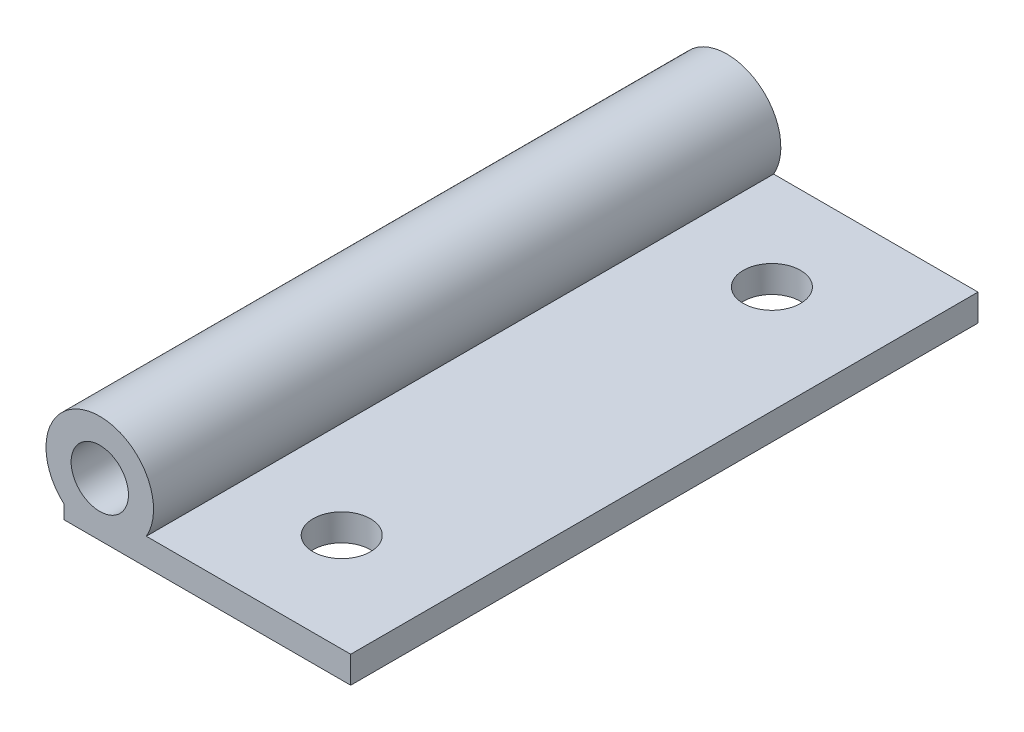
ISO-10303-21;
HEADER;
FILE_DESCRIPTION(('STEP AP214'),'2;1');
FILE_NAME('part.step','',(''),(''),'','','');
FILE_SCHEMA(('AUTOMOTIVE_DESIGN { 1 0 10303 214 1 1 1 1 }'));
ENDSEC;
DATA;
#1=APPLICATION_CONTEXT('core data for automotive mechanical design processes');
#2=APPLICATION_PROTOCOL_DEFINITION('international standard','automotive_design',2000,#1);
#3=PRODUCT_CONTEXT('',#1,'mechanical');
#4=PRODUCT('Part','Part','',(#3));
#5=PRODUCT_RELATED_PRODUCT_CATEGORY('part','',(#4));
#6=PRODUCT_DEFINITION_FORMATION('','',#4);
#7=PRODUCT_DEFINITION_CONTEXT('part definition',#1,'design');
#8=PRODUCT_DEFINITION('design','',#6,#7);
#9=PRODUCT_DEFINITION_SHAPE('','',#8);
#10=(LENGTH_UNIT() NAMED_UNIT(*) SI_UNIT(.MILLI.,.METRE.));
#11=(NAMED_UNIT(*) PLANE_ANGLE_UNIT() SI_UNIT($,.RADIAN.));
#12=(NAMED_UNIT(*) SI_UNIT($,.STERADIAN.) SOLID_ANGLE_UNIT());
#13=UNCERTAINTY_MEASURE_WITH_UNIT(LENGTH_MEASURE(1.E-05),#10,'distance_accuracy_value','');
#14=(GEOMETRIC_REPRESENTATION_CONTEXT(3) GLOBAL_UNCERTAINTY_ASSIGNED_CONTEXT((#13)) GLOBAL_UNIT_ASSIGNED_CONTEXT((#10,
#11,#12)) REPRESENTATION_CONTEXT('',''));
#15=CARTESIAN_POINT('',(0.,0.,0.));
#16=DIRECTION('',(0.,0.,1.));
#17=DIRECTION('',(1.,0.,0.));
#18=AXIS2_PLACEMENT_3D('',#15,#16,#17);
#19=CARTESIAN_POINT('',(0.,0.,17.5));
#20=DIRECTION('',(0.,0.,-1.));
#21=DIRECTION('',(-1.,0.,0.));
#22=AXIS2_PLACEMENT_3D('',#19,#20,#21);
#23=CYLINDRICAL_SURFACE('',#22,3.);
#24=DIRECTION('',(0.,0.,-1.));
#25=VECTOR('',#24,1.);
#26=CARTESIAN_POINT('',(-2.,-2.23606797749979,17.5));
#27=LINE('',#26,#25);
#28=CARTESIAN_POINT('',(-2.,-2.23606797749979,17.5));
#29=VERTEX_POINT('',#28);
#30=CARTESIAN_POINT('',(-2.,-2.23606797749979,-17.5));
#31=VERTEX_POINT('',#30);
#32=EDGE_CURVE('E58',#29,#31,#27,.T.);
#33=ORIENTED_EDGE('',*,*,#32,.F.);
#34=CARTESIAN_POINT('',(0.,0.,17.5));
#35=DIRECTION('',(0.,0.,1.));
#36=DIRECTION('',(1.,0.,0.));
#37=AXIS2_PLACEMENT_3D('',#34,#35,#36);
#38=CIRCLE('',#37,3.);
#39=CARTESIAN_POINT('',(2.59807621135332,-1.5,17.5));
#40=VERTEX_POINT('',#39);
#41=EDGE_CURVE('E11',#40,#29,#38,.T.);
#42=ORIENTED_EDGE('',*,*,#41,.F.);
#43=DIRECTION('',(0.,0.,-1.));
#44=VECTOR('',#43,1.);
#45=CARTESIAN_POINT('',(2.59807621135332,-1.5,17.5));
#46=LINE('',#45,#44);
#47=CARTESIAN_POINT('',(2.59807621135332,-1.5,-17.5));
#48=VERTEX_POINT('',#47);
#49=EDGE_CURVE('E106',#48,#40,#46,.F.);
#50=ORIENTED_EDGE('',*,*,#49,.F.);
#51=CARTESIAN_POINT('',(0.,0.,-17.5));
#52=DIRECTION('',(0.,0.,1.));
#53=DIRECTION('',(1.,0.,0.));
#54=AXIS2_PLACEMENT_3D('',#51,#52,#53);
#55=CIRCLE('',#54,3.);
#56=EDGE_CURVE('E47',#48,#31,#55,.T.);
#57=ORIENTED_EDGE('',*,*,#56,.T.);
#58=EDGE_LOOP('',(#33,#42,#50,#57));
#59=FACE_BOUND('',#58,.T.);
#60=ADVANCED_FACE('F39',(#59),#23,.T.);
#61=CARTESIAN_POINT('',(0.,0.,17.5));
#62=DIRECTION('',(0.,0.,1.));
#63=DIRECTION('',(1.,0.,0.));
#64=AXIS2_PLACEMENT_3D('',#61,#62,#63);
#65=PLANE('',#64);
#66=CARTESIAN_POINT('',(0.,0.,17.5));
#67=DIRECTION('',(0.,0.,1.));
#68=DIRECTION('',(1.,0.,0.));
#69=AXIS2_PLACEMENT_3D('',#66,#67,#68);
#70=CIRCLE('',#69,1.6);
#71=CARTESIAN_POINT('',(1.6,0.,17.5));
#72=VERTEX_POINT('',#71);
#73=EDGE_CURVE('E117',#72,#72,#70,.F.);
#74=ORIENTED_EDGE('',*,*,#73,.T.);
#75=EDGE_LOOP('',(#74));
#76=FACE_BOUND('',#75,.T.);
#77=ORIENTED_EDGE('',*,*,#41,.T.);
#78=DIRECTION('',(0.,-1.,0.));
#79=VECTOR('',#78,1.);
#80=CARTESIAN_POINT('',(-2.,-1.5,17.5));
#81=LINE('',#80,#79);
#82=CARTESIAN_POINT('',(-2.,-3.,17.5));
#83=VERTEX_POINT('',#82);
#84=EDGE_CURVE('E83',#29,#83,#81,.T.);
#85=ORIENTED_EDGE('',*,*,#84,.T.);
#86=DIRECTION('',(1.,0.,0.));
#87=VECTOR('',#86,1.);
#88=CARTESIAN_POINT('',(-2.,-3.,17.5));
#89=LINE('',#88,#87);
#90=CARTESIAN_POINT('',(14.,-3.,17.5));
#91=VERTEX_POINT('',#90);
#92=EDGE_CURVE('E86',#83,#91,#89,.T.);
#93=ORIENTED_EDGE('',*,*,#92,.T.);
#94=DIRECTION('',(0.,1.,0.));
#95=VECTOR('',#94,1.);
#96=CARTESIAN_POINT('',(14.,-3.,17.5));
#97=LINE('',#96,#95);
#98=CARTESIAN_POINT('',(14.,-1.5,17.5));
#99=VERTEX_POINT('',#98);
#100=EDGE_CURVE('E100',#91,#99,#97,.T.);
#101=ORIENTED_EDGE('',*,*,#100,.T.);
#102=DIRECTION('',(-1.,0.,0.));
#103=VECTOR('',#102,1.);
#104=CARTESIAN_POINT('',(14.,-1.5,17.5));
#105=LINE('',#104,#103);
#106=EDGE_CURVE('E135',#99,#40,#105,.T.);
#107=ORIENTED_EDGE('',*,*,#106,.T.);
#108=EDGE_LOOP('',(#77,#85,#93,#101,#107));
#109=FACE_BOUND('',#108,.T.);
#110=ADVANCED_FACE('F85',(#76,#109),#65,.T.);
#111=CARTESIAN_POINT('',(0.,0.,-17.5));
#112=DIRECTION('',(0.,0.,1.));
#113=DIRECTION('',(1.,0.,0.));
#114=AXIS2_PLACEMENT_3D('',#111,#112,#113);
#115=PLANE('',#114);
#116=CARTESIAN_POINT('',(0.,0.,-17.5));
#117=DIRECTION('',(0.,0.,1.));
#118=DIRECTION('',(1.,0.,0.));
#119=AXIS2_PLACEMENT_3D('',#116,#117,#118);
#120=CIRCLE('',#119,1.6);
#121=CARTESIAN_POINT('',(1.6,0.,-17.5));
#122=VERTEX_POINT('',#121);
#123=EDGE_CURVE('E115',#122,#122,#120,.F.);
#124=ORIENTED_EDGE('',*,*,#123,.F.);
#125=EDGE_LOOP('',(#124));
#126=FACE_BOUND('',#125,.T.);
#127=DIRECTION('',(1.,0.,0.));
#128=VECTOR('',#127,1.);
#129=CARTESIAN_POINT('',(-2.,-3.,-17.5));
#130=LINE('',#129,#128);
#131=CARTESIAN_POINT('',(-2.,-3.,-17.5));
#132=VERTEX_POINT('',#131);
#133=CARTESIAN_POINT('',(14.,-3.,-17.5));
#134=VERTEX_POINT('',#133);
#135=EDGE_CURVE('E138',#132,#134,#130,.T.);
#136=ORIENTED_EDGE('',*,*,#135,.F.);
#137=DIRECTION('',(0.,-1.,0.));
#138=VECTOR('',#137,1.);
#139=CARTESIAN_POINT('',(-2.,-1.5,-17.5));
#140=LINE('',#139,#138);
#141=EDGE_CURVE('E105',#31,#132,#140,.T.);
#142=ORIENTED_EDGE('',*,*,#141,.F.);
#143=ORIENTED_EDGE('',*,*,#56,.F.);
#144=DIRECTION('',(-1.,0.,0.));
#145=VECTOR('',#144,1.);
#146=CARTESIAN_POINT('',(14.,-1.5,-17.5));
#147=LINE('',#146,#145);
#148=CARTESIAN_POINT('',(14.,-1.5,-17.5));
#149=VERTEX_POINT('',#148);
#150=EDGE_CURVE('E91',#149,#48,#147,.T.);
#151=ORIENTED_EDGE('',*,*,#150,.F.);
#152=DIRECTION('',(0.,1.,0.));
#153=VECTOR('',#152,1.);
#154=CARTESIAN_POINT('',(14.,-3.,-17.5));
#155=LINE('',#154,#153);
#156=EDGE_CURVE('E140',#134,#149,#155,.T.);
#157=ORIENTED_EDGE('',*,*,#156,.F.);
#158=EDGE_LOOP('',(#136,#142,#143,#151,#157));
#159=FACE_BOUND('',#158,.T.);
#160=ADVANCED_FACE('F152',(#126,#159),#115,.F.);
#161=CARTESIAN_POINT('',(-2.,-1.5,17.5));
#162=DIRECTION('',(1.,0.,0.));
#163=DIRECTION('',(0.,0.,-1.));
#164=AXIS2_PLACEMENT_3D('',#161,#162,#163);
#165=PLANE('',#164);
#166=ORIENTED_EDGE('',*,*,#84,.F.);
#167=ORIENTED_EDGE('',*,*,#32,.T.);
#168=ORIENTED_EDGE('',*,*,#141,.T.);
#169=DIRECTION('',(0.,0.,-1.));
#170=VECTOR('',#169,1.);
#171=CARTESIAN_POINT('',(-2.,-3.,17.5));
#172=LINE('',#171,#170);
#173=EDGE_CURVE('E96',#83,#132,#172,.T.);
#174=ORIENTED_EDGE('',*,*,#173,.F.);
#175=EDGE_LOOP('',(#166,#167,#168,#174));
#176=FACE_BOUND('',#175,.T.);
#177=ADVANCED_FACE('F103',(#176),#165,.F.);
#178=CARTESIAN_POINT('',(-2.,-3.,17.5));
#179=DIRECTION('',(0.,1.,0.));
#180=DIRECTION('',(0.,0.,1.));
#181=AXIS2_PLACEMENT_3D('',#178,#179,#180);
#182=PLANE('',#181);
#183=CARTESIAN_POINT('',(8.,-3.,12.));
#184=DIRECTION('',(0.,1.,0.));
#185=DIRECTION('',(0.,0.,1.));
#186=AXIS2_PLACEMENT_3D('',#183,#184,#185);
#187=CIRCLE('',#186,1.6);
#188=CARTESIAN_POINT('',(8.,-3.,13.6));
#189=VERTEX_POINT('',#188);
#190=EDGE_CURVE('E121',#189,#189,#187,.T.);
#191=ORIENTED_EDGE('',*,*,#190,.T.);
#192=EDGE_LOOP('',(#191));
#193=FACE_BOUND('',#192,.T.);
#194=CARTESIAN_POINT('',(8.,-3.,-12.));
#195=DIRECTION('',(0.,1.,0.));
#196=DIRECTION('',(0.,0.,1.));
#197=AXIS2_PLACEMENT_3D('',#194,#195,#196);
#198=CIRCLE('',#197,1.6);
#199=CARTESIAN_POINT('',(8.,-3.,-10.4));
#200=VERTEX_POINT('',#199);
#201=EDGE_CURVE('E118',#200,#200,#198,.T.);
#202=ORIENTED_EDGE('',*,*,#201,.T.);
#203=EDGE_LOOP('',(#202));
#204=FACE_BOUND('',#203,.T.);
#205=DIRECTION('',(0.,0.,-1.));
#206=VECTOR('',#205,1.);
#207=CARTESIAN_POINT('',(14.,-3.,17.5));
#208=LINE('',#207,#206);
#209=EDGE_CURVE('E98',#91,#134,#208,.T.);
#210=ORIENTED_EDGE('',*,*,#209,.F.);
#211=ORIENTED_EDGE('',*,*,#92,.F.);
#212=ORIENTED_EDGE('',*,*,#173,.T.);
#213=ORIENTED_EDGE('',*,*,#135,.T.);
#214=EDGE_LOOP('',(#210,#211,#212,#213));
#215=FACE_BOUND('',#214,.T.);
#216=ADVANCED_FACE('F95',(#193,#204,#215),#182,.F.);
#217=CARTESIAN_POINT('',(14.,-1.5,17.5));
#218=DIRECTION('',(0.,-1.,0.));
#219=DIRECTION('',(0.,0.,-1.));
#220=AXIS2_PLACEMENT_3D('',#217,#218,#219);
#221=PLANE('',#220);
#222=CARTESIAN_POINT('',(8.,-1.5,12.));
#223=DIRECTION('',(0.,-1.,0.));
#224=DIRECTION('',(0.,0.,-1.));
#225=AXIS2_PLACEMENT_3D('',#222,#223,#224);
#226=CIRCLE('',#225,1.6);
#227=CARTESIAN_POINT('',(8.,-1.5,10.4));
#228=VERTEX_POINT('',#227);
#229=EDGE_CURVE('E42',#228,#228,#226,.T.);
#230=ORIENTED_EDGE('',*,*,#229,.T.);
#231=EDGE_LOOP('',(#230));
#232=FACE_BOUND('',#231,.T.);
#233=CARTESIAN_POINT('',(8.,-1.5,-12.));
#234=DIRECTION('',(0.,-1.,0.));
#235=DIRECTION('',(0.,0.,-1.));
#236=AXIS2_PLACEMENT_3D('',#233,#234,#235);
#237=CIRCLE('',#236,1.6);
#238=CARTESIAN_POINT('',(8.,-1.5,-13.6));
#239=VERTEX_POINT('',#238);
#240=EDGE_CURVE('E119',#239,#239,#237,.T.);
#241=ORIENTED_EDGE('',*,*,#240,.T.);
#242=EDGE_LOOP('',(#241));
#243=FACE_BOUND('',#242,.T.);
#244=ORIENTED_EDGE('',*,*,#150,.T.);
#245=ORIENTED_EDGE('',*,*,#49,.T.);
#246=ORIENTED_EDGE('',*,*,#106,.F.);
#247=DIRECTION('',(0.,0.,-1.));
#248=VECTOR('',#247,1.);
#249=CARTESIAN_POINT('',(14.,-1.5,17.5));
#250=LINE('',#249,#248);
#251=EDGE_CURVE('E109',#99,#149,#250,.T.);
#252=ORIENTED_EDGE('',*,*,#251,.T.);
#253=EDGE_LOOP('',(#244,#245,#246,#252));
#254=FACE_BOUND('',#253,.T.);
#255=ADVANCED_FACE('F148',(#232,#243,#254),#221,.F.);
#256=CARTESIAN_POINT('',(14.,-3.,17.5));
#257=DIRECTION('',(-1.,0.,0.));
#258=DIRECTION('',(0.,0.,1.));
#259=AXIS2_PLACEMENT_3D('',#256,#257,#258);
#260=PLANE('',#259);
#261=ORIENTED_EDGE('',*,*,#156,.T.);
#262=ORIENTED_EDGE('',*,*,#251,.F.);
#263=ORIENTED_EDGE('',*,*,#100,.F.);
#264=ORIENTED_EDGE('',*,*,#209,.T.);
#265=EDGE_LOOP('',(#261,#262,#263,#264));
#266=FACE_BOUND('',#265,.T.);
#267=ADVANCED_FACE('F153',(#266),#260,.F.);
#268=CARTESIAN_POINT('',(0.,0.,20.));
#269=DIRECTION('',(0.,0.,-1.));
#270=DIRECTION('',(-1.,0.,0.));
#271=AXIS2_PLACEMENT_3D('',#268,#269,#270);
#272=CYLINDRICAL_SURFACE('',#271,1.6);
#273=ORIENTED_EDGE('',*,*,#73,.F.);
#274=EDGE_LOOP('',(#273));
#275=FACE_BOUND('',#274,.T.);
#276=ORIENTED_EDGE('',*,*,#123,.T.);
#277=EDGE_LOOP('',(#276));
#278=FACE_BOUND('',#277,.T.);
#279=ADVANCED_FACE('F155',(#275,#278),#272,.F.);
#280=CARTESIAN_POINT('',(8.,-100.,-12.));
#281=DIRECTION('',(0.,1.,0.));
#282=DIRECTION('',(0.,0.,1.));
#283=AXIS2_PLACEMENT_3D('',#280,#281,#282);
#284=CYLINDRICAL_SURFACE('',#283,1.6);
#285=ORIENTED_EDGE('',*,*,#240,.F.);
#286=EDGE_LOOP('',(#285));
#287=FACE_BOUND('',#286,.T.);
#288=ORIENTED_EDGE('',*,*,#201,.F.);
#289=EDGE_LOOP('',(#288));
#290=FACE_BOUND('',#289,.T.);
#291=ADVANCED_FACE('F161',(#287,#290),#284,.F.);
#292=CARTESIAN_POINT('',(8.,-100.,12.));
#293=DIRECTION('',(0.,1.,0.));
#294=DIRECTION('',(0.,0.,1.));
#295=AXIS2_PLACEMENT_3D('',#292,#293,#294);
#296=CYLINDRICAL_SURFACE('',#295,1.6);
#297=ORIENTED_EDGE('',*,*,#229,.F.);
#298=EDGE_LOOP('',(#297));
#299=FACE_BOUND('',#298,.T.);
#300=ORIENTED_EDGE('',*,*,#190,.F.);
#301=EDGE_LOOP('',(#300));
#302=FACE_BOUND('',#301,.T.);
#303=ADVANCED_FACE('F186',(#299,#302),#296,.F.);
#304=CLOSED_SHELL('',(#60,#110,#160,#177,#216,#255,#267,#279,#291,#303));
#305=MANIFOLD_SOLID_BREP('B2',#304);
#306=ADVANCED_BREP_SHAPE_REPRESENTATION('',(#18,#305),#14);
#307=SHAPE_DEFINITION_REPRESENTATION(#9,#306);
ENDSEC;
END-ISO-10303-21;
